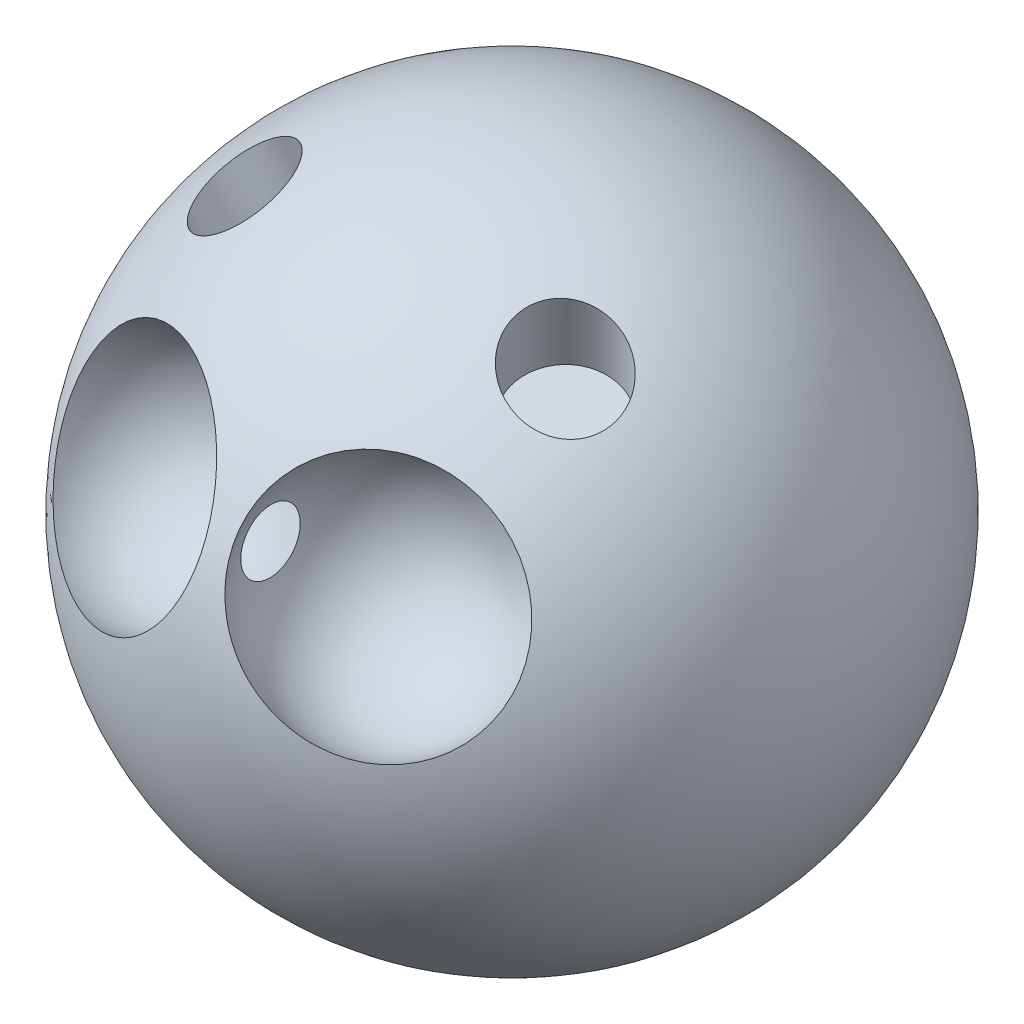
ISO-10303-21;
HEADER;
FILE_DESCRIPTION(('STEP AP214'),'2;1');
FILE_NAME('part.step','',(''),(''),'','','');
FILE_SCHEMA(('AUTOMOTIVE_DESIGN { 1 0 10303 214 1 1 1 1 }'));
ENDSEC;
DATA;
#1=APPLICATION_CONTEXT('core data for automotive mechanical design processes');
#2=APPLICATION_PROTOCOL_DEFINITION('international standard','automotive_design',2000,#1);
#3=PRODUCT_CONTEXT('',#1,'mechanical');
#4=PRODUCT('Part','Part','',(#3));
#5=PRODUCT_RELATED_PRODUCT_CATEGORY('part','',(#4));
#6=PRODUCT_DEFINITION_FORMATION('','',#4);
#7=PRODUCT_DEFINITION_CONTEXT('part definition',#1,'design');
#8=PRODUCT_DEFINITION('design','',#6,#7);
#9=PRODUCT_DEFINITION_SHAPE('','',#8);
#10=(LENGTH_UNIT() NAMED_UNIT(*) SI_UNIT(.MILLI.,.METRE.));
#11=(NAMED_UNIT(*) PLANE_ANGLE_UNIT() SI_UNIT($,.RADIAN.));
#12=(NAMED_UNIT(*) SI_UNIT($,.STERADIAN.) SOLID_ANGLE_UNIT());
#13=UNCERTAINTY_MEASURE_WITH_UNIT(LENGTH_MEASURE(1.E-05),#10,'distance_accuracy_value','');
#14=(GEOMETRIC_REPRESENTATION_CONTEXT(3) GLOBAL_UNCERTAINTY_ASSIGNED_CONTEXT((#13)) GLOBAL_UNIT_ASSIGNED_CONTEXT((#10,
#11,#12)) REPRESENTATION_CONTEXT('',''));
#15=CARTESIAN_POINT('',(0.,0.,0.));
#16=DIRECTION('',(0.,0.,1.));
#17=DIRECTION('',(1.,0.,0.));
#18=AXIS2_PLACEMENT_3D('',#15,#16,#17);
#19=CARTESIAN_POINT('',(2.3203755460968,10.677854660032,2.37286682040429));
#20=DIRECTION('',(0.207514785544147,0.9549371107515,0.212209161654592));
#21=DIRECTION('',(0.,-0.216931348988181,0.976186862145854));
#22=AXIS2_PLACEMENT_3D('',#19,#20,#21);
#23=PLANE('',#22);
#24=CARTESIAN_POINT('',(6.83732854207996,9.24554378475854,4.40120656455625));
#25=DIRECTION('',(0.207514785544146,0.9549371107515,0.212209161654592));
#26=DIRECTION('',(0.,-0.216931348988181,0.976186862145854));
#27=AXIS2_PLACEMENT_3D('',#24,#25,#26);
#28=CIRCLE('',#27,2.25);
#29=CARTESIAN_POINT('',(6.83732854207996,8.75744824953514,6.59762700438442));
#30=VERTEX_POINT('',#29);
#31=EDGE_CURVE('E22',#30,#30,#28,.T.);
#32=ORIENTED_EDGE('',*,*,#31,.T.);
#33=EDGE_LOOP('',(#32));
#34=FACE_BOUND('',#33,.T.);
#35=ADVANCED_FACE('F17',(#34),#23,.T.);
#36=CARTESIAN_POINT('',(6.83732854207996,9.24554378475854,4.40120656455625));
#37=DIRECTION('',(0.207514785544146,0.9549371107515,0.212209161654592));
#38=DIRECTION('',(0.,-0.216931348988181,0.976186862145854));
#39=AXIS2_PLACEMENT_3D('',#36,#37,#38);
#40=CYLINDRICAL_SURFACE('',#39,2.25);
#41=ORIENTED_EDGE('',*,*,#31,.F.);
#42=EDGE_LOOP('',(#41));
#43=FACE_BOUND('',#42,.T.);
#44=CARTESIAN_POINT('',(7.4785121058429,12.6842241577591,2.86047447086711));
#45=CARTESIAN_POINT('',(7.60103985984923,12.6154258421237,2.84519672109731));
#46=CARTESIAN_POINT('',(7.72271245972928,12.5421947693737,2.84130911592228));
#47=CARTESIAN_POINT('',(7.96072406003778,12.3891273387208,2.85597069634072));
#48=CARTESIAN_POINT('',(8.07704779526739,12.309273703742,2.87458040520665));
#49=CARTESIAN_POINT('',(8.30071690439664,12.145512988355,2.9333651382507));
#50=CARTESIAN_POINT('',(8.40807975295584,12.0616143256395,2.97349699998186));
#51=CARTESIAN_POINT('',(8.61109351229488,11.8919805990403,3.07406710184202));
#52=CARTESIAN_POINT('',(8.7067507495368,11.8062465568165,3.13449430634459));
#53=CARTESIAN_POINT('',(8.88517495349177,11.6338675983562,3.27527975958107));
#54=CARTESIAN_POINT('',(8.96770728920141,11.547230508384,3.35594582410442));
#55=CARTESIAN_POINT('',(9.11531227635691,11.3770586819066,3.53472675100574));
#56=CARTESIAN_POINT('',(9.18038329151202,11.29352423678,3.63284324722251));
#57=CARTESIAN_POINT('',(9.28932687738384,11.134186692806,3.84161990098054));
#58=CARTESIAN_POINT('',(9.33364869050764,11.0582507988136,3.95194329672969));
#59=CARTESIAN_POINT('',(9.40120780498793,10.9147483884994,4.18393150816854));
#60=CARTESIAN_POINT('',(9.42445323376333,10.8471786547275,4.30559193212877));
#61=CARTESIAN_POINT('',(9.44761580119429,10.7268971305227,4.54903027891771));
#62=CARTESIAN_POINT('',(9.44885185335802,10.6735361628303,4.67036109384015));
#63=CARTESIAN_POINT('',(9.4306826112496,10.5788163455998,4.91612373439234));
#64=CARTESIAN_POINT('',(9.41128754978553,10.537451559031,5.04055399285114));
#65=CARTESIAN_POINT('',(9.35407697091048,10.4708768564171,5.27987774770868));
#66=CARTESIAN_POINT('',(9.31761108902991,10.4447560052466,5.39484178204949));
#67=CARTESIAN_POINT('',(9.22784676195085,10.4054779075706,5.62031772445839));
#68=CARTESIAN_POINT('',(9.17455275990638,10.3923172429409,5.7308307990455));
#69=CARTESIAN_POINT('',(9.05516794182463,10.3796161069456,5.9398200127197));
#70=CARTESIAN_POINT('',(8.98965613863802,10.379565299891,6.03859727502475));
#71=CARTESIAN_POINT('',(8.84662095554112,10.3916288934296,6.22617794757083));
#72=CARTESIAN_POINT('',(8.76909865815432,10.4037421981924,6.3149822554459));
#73=CARTESIAN_POINT('',(8.60359791809942,10.4396557080024,6.48119602771535));
#74=CARTESIAN_POINT('',(8.51552841679281,10.4635642167804,6.55849108408079));
#75=CARTESIAN_POINT('',(8.33200574154263,10.5221030559701,6.69904872952074));
#76=CARTESIAN_POINT('',(8.23654782957956,10.5567403099361,6.76230221180096));
#77=CARTESIAN_POINT('',(8.03582768281209,10.6374708464962,6.87643842939391));
#78=CARTESIAN_POINT('',(7.9303137124515,10.6840584295398,6.92652541476343));
#79=CARTESIAN_POINT('',(7.71687488225179,10.7860161440531,7.0090903615867));
#80=CARTESIAN_POINT('',(7.6089543933069,10.8413713156814,7.04159790856278));
#81=CARTESIAN_POINT('',(7.47171462931442,10.9163378355368,7.07164921182621));
#82=CARTESIAN_POINT('',(7.44225566129432,10.9326985377208,7.07743607028014));
#83=CARTESIAN_POINT('',(7.3833928465352,10.9659195738631,7.08768557153004));
#84=CARTESIAN_POINT('',(7.35398899545271,10.9827798665257,7.09214832344126));
#85=CARTESIAN_POINT('',(7.20225942373118,11.0711479034898,7.11178032346351));
#86=CARTESIAN_POINT('',(7.0805951855199,11.1466017959765,7.11609093009157));
#87=CARTESIAN_POINT('',(6.84224550659412,11.3034273129031,7.10188010699347));
#88=CARTESIAN_POINT('',(6.72557378789431,11.384813768751,7.08329946940093));
#89=CARTESIAN_POINT('',(6.50077705093237,11.5509293147375,7.02397995612368));
#90=CARTESIAN_POINT('',(6.39263989310173,11.6356533903615,6.98327322772186));
#91=CARTESIAN_POINT('',(6.18786907318596,11.8061422803649,6.88081743460818));
#92=CARTESIAN_POINT('',(6.091228884652,11.8919064735376,6.81908038575946));
#93=CARTESIAN_POINT('',(5.91187710440432,12.0625629373178,6.67569053918166));
#94=CARTESIAN_POINT('',(5.82923622412704,12.1474488600708,6.59394145359302));
#95=CARTESIAN_POINT('',(5.68134316332917,12.3134144698102,6.41270020997014));
#96=CARTESIAN_POINT('',(5.61609070664043,12.3944942172306,6.3132083337741));
#97=CARTESIAN_POINT('',(5.50753328140063,12.5475798116244,6.10282791568016));
#98=CARTESIAN_POINT('',(5.46355503328422,12.6198009493357,5.9924444661757));
#99=CARTESIAN_POINT('',(5.39638274946188,12.7558729383684,5.76072217716508));
#100=CARTESIAN_POINT('',(5.37318090772412,12.8197269256594,5.63938747110033));
#101=CARTESIAN_POINT('',(5.34974247248207,12.9333696536509,5.39678005356226));
#102=CARTESIAN_POINT('',(5.34825604464876,12.9837580253554,5.27590908877723));
#103=CARTESIAN_POINT('',(5.36565427214117,13.0732859308473,5.03149534051164));
#104=CARTESIAN_POINT('',(5.38453136421555,13.1124296342018,4.90795356569675));
#105=CARTESIAN_POINT('',(5.44085089555553,13.1762327826826,4.66896540957149));
#106=CARTESIAN_POINT('',(5.47722175730061,13.2015671831209,4.55344574570772));
#107=CARTESIAN_POINT('',(5.56705413971028,13.2400558720007,4.32712519164566));
#108=CARTESIAN_POINT('',(5.62051235917482,13.2532125112192,4.21632339465863));
#109=CARTESIAN_POINT('',(5.74114790833286,13.2667548012328,4.00584309256731));
#110=CARTESIAN_POINT('',(5.80789069940385,13.2674938265754,3.90593753727263));
#111=CARTESIAN_POINT('',(5.95394296836148,13.2571722194252,3.71648727213736));
#112=CARTESIAN_POINT('',(6.03325114291118,13.2461128100368,3.62694148940039));
#113=CARTESIAN_POINT('',(6.20261271431301,13.2125408579979,3.45989718792941));
#114=CARTESIAN_POINT('',(6.29273588289742,13.1899505110118,3.38248524117835));
#115=CARTESIAN_POINT('',(6.48068259915085,13.1340673960499,3.24215524100024));
#116=CARTESIAN_POINT('',(6.57851087854388,13.1007680123236,3.17924618841809));
#117=CARTESIAN_POINT('',(6.78302100440717,13.0230490609199,3.06700629306905));
#118=CARTESIAN_POINT('',(6.88989940171491,12.9782460450068,3.01830157346337));
#119=CARTESIAN_POINT('',(7.10589471378514,12.8796745863431,2.93868490762089));
#120=CARTESIAN_POINT('',(7.21500717820352,12.8259226862412,2.907740590966));
#121=CARTESIAN_POINT('',(7.37547806704141,12.7412109489824,2.87531045217282));
#122=CARTESIAN_POINT('',(7.4270704524121,12.7131082186662,2.86688863160346));
#123=CARTESIAN_POINT('',(7.4785121058429,12.6842241577591,2.86047447086711));
#124=B_SPLINE_CURVE_WITH_KNOTS('',3,(#44,#45,#46,#47,#48,#49,#50,#51,#52,#53,#54,#55,#56,#57,
#58,#59,#60,#61,#62,#63,#64,#65,#66,#67,#68,#69,#70,#71,#72,#73,#74,#75,#76,#77,#78,#79,#80,#81,
#82,#83,#84,#85,#86,#87,#88,#89,#90,#91,#92,#93,#94,#95,#96,#97,#98,#99,#100,#101,#102,#103,
#104,#105,#106,#107,#108,#109,#110,#111,#112,#113,#114,#115,#116,#117,#118,#119,#120,#121,#122,
#123),.UNSPECIFIED.,.T.,.F.,(4,2,2,2,2,2,2,2,2,2,2,2,2,2,2,2,2,2,2,2,2,2,2,2,2,2,2,2,2,2,2,2,2,
2,2,2,2,2,2,4),(0.,0.423871964808461,0.848886790879534,1.27305242442544,1.69698778959754,
2.12780957699162,2.55867172237075,2.9797162514107,3.40059834924786,3.79616809217035,
4.19154172824241,4.55989178228237,4.92814466150931,5.28206007781559,5.63594361374258,
5.99313874567525,6.35056486739134,6.72622578878604,7.10125250396811,7.20380594983477,
7.30635094226107,7.7336863392884,8.16212935726978,8.58995154233865,9.01752969620657,
9.44720703506227,9.87687754924725,10.291877966349,10.7067223955823,11.0975897039997,
11.4883118896585,11.8576696954312,12.2269561860364,12.5857153126544,12.944437251527,
13.3056122874628,13.6670108774691,14.042521376796,14.4173452728275,14.5953022988869),.UNSPECIFIED.);
#125=CARTESIAN_POINT('',(7.4785121058429,12.6842241577591,2.86047447086711));
#126=VERTEX_POINT('',#125);
#127=EDGE_CURVE('E49',#126,#126,#124,.T.);
#128=ORIENTED_EDGE('',*,*,#127,.F.);
#129=EDGE_LOOP('',(#128));
#130=FACE_BOUND('',#129,.T.);
#131=ADVANCED_FACE('F83',(#43,#130),#40,.F.);
#132=CARTESIAN_POINT('',(-4.2557417320725,8.92650718043939,2.49077389771273));
#133=DIRECTION('',(0.417314178615178,-0.875325206845538,-0.24424303180962));
#134=DIRECTION('',(0.902663218723563,0.430347665920957,0.));
#135=AXIS2_PLACEMENT_3D('',#132,#133,#134);
#136=PLANE('',#135);
#137=CARTESIAN_POINT('',(-5.02179504310474,8.09303607790022,4.16891125919332));
#138=DIRECTION('',(-0.417314178615178,0.875325206845538,0.24424303180962));
#139=DIRECTION('',(-0.902663218723563,-0.430347665920958,0.));
#140=AXIS2_PLACEMENT_3D('',#137,#138,#139);
#141=CIRCLE('',#140,2.25);
#142=CARTESIAN_POINT('',(-7.05278728523276,7.12475382957807,4.16891125919332));
#143=VERTEX_POINT('',#142);
#144=EDGE_CURVE('E48',#143,#143,#141,.T.);
#145=ORIENTED_EDGE('',*,*,#144,.T.);
#146=EDGE_LOOP('',(#145));
#147=FACE_BOUND('',#146,.T.);
#148=ADVANCED_FACE('F38',(#147),#136,.F.);
#149=CARTESIAN_POINT('',(5.44495098577105,4.93559259326842,11.2490065171851));
#150=DIRECTION('',(-0.997531014771984,0.00821354652691298,-0.0697453383490687));
#151=DIRECTION('',(0.,0.993137027427932,0.116956593450783));
#152=AXIS2_PLACEMENT_3D('',#149,#150,#151);
#153=CIRCLE('',#152,5.1);
#154=TRIMMED_CURVE('',#153,(PARAMETER_VALUE(-1.60235416746791)),
(PARAMETER_VALUE(1.60235416746791)),.T.,.PARAMETER.);
#155=CARTESIAN_POINT('',(5.44495098577105,4.7757786963244,11.2301860639582));
#156=DIRECTION('',(0.0702273064268867,0.116667829349234,-0.990684986777816));
#157=AXIS1_PLACEMENT('',#155,#156);
#158=SURFACE_OF_REVOLUTION('',#154,#157);
#159=CARTESIAN_POINT('',(5.80293191530973,5.37048836821735,6.1802083046876));
#160=VERTEX_POINT('',#159);
#161=VERTEX_LOOP('',#160);
#162=FACE_BOUND('',#161,.T.);
#163=CARTESIAN_POINT('',(0.386069457796595,6.02429740025218,11.9371788407207));
#164=CARTESIAN_POINT('',(0.383571294539956,6.05592016865654,11.8664813614156));
#165=CARTESIAN_POINT('',(0.381051556847846,6.08160635049293,11.7930530194618));
#166=CARTESIAN_POINT('',(0.376039469427233,6.12028130063957,11.6427944021987));
#167=CARTESIAN_POINT('',(0.373547187724449,6.13324349400914,11.5659573556862));
#168=CARTESIAN_POINT('',(0.36866582637556,6.14601637372121,11.4112483808981));
#169=CARTESIAN_POINT('',(0.366276665895042,6.14583755548152,11.3333773281613));
#170=CARTESIAN_POINT('',(0.361667461577325,6.13237868015937,11.1788110713337));
#171=CARTESIAN_POINT('',(0.359447340550708,6.11910464193842,11.1021153434828));
#172=CARTESIAN_POINT('',(0.355239096472867,6.07992316029254,10.9521369963029));
#173=CARTESIAN_POINT('',(0.353250643782945,6.05403394577828,10.8788496187954));
#174=CARTESIAN_POINT('',(0.349555630819854,5.99042551881705,10.7375913034767));
#175=CARTESIAN_POINT('',(0.347849101736138,5.95270499879879,10.6696209543301));
#176=CARTESIAN_POINT('',(0.344748922357896,5.86615320060616,10.5402316053568));
#177=CARTESIAN_POINT('',(0.343358363300307,5.81722083276199,10.4788801801706));
#178=CARTESIAN_POINT('',(0.34094762904314,5.70988713194088,10.3651061612302));
#179=CARTESIAN_POINT('',(0.339927477977902,5.65148518232143,10.3126841494));
#180=CARTESIAN_POINT('',(0.338271833790109,5.52594464260176,10.2174233109198));
#181=CARTESIAN_POINT('',(0.337642286082526,5.45868905267452,10.1747385770551));
#182=CARTESIAN_POINT('',(0.336808393884095,5.31804554913335,10.1010724737334));
#183=CARTESIAN_POINT('',(0.336604084750955,5.24465712611469,10.0700920776434));
#184=CARTESIAN_POINT('',(0.336625919871889,5.0927014657518,10.0202749058728));
#185=CARTESIAN_POINT('',(0.336858263878413,5.01407516098749,10.0016181935033));
#186=CARTESIAN_POINT('',(0.337758973323696,4.85481313509537,9.97765919588256));
#187=CARTESIAN_POINT('',(0.338427366522752,4.77417728634789,9.97235776097585));
#188=CARTESIAN_POINT('',(0.340187775180031,4.61258666423818,9.97528235372078));
#189=CARTESIAN_POINT('',(0.341282724191338,4.53163361141526,9.98360336452438));
#190=CARTESIAN_POINT('',(0.343865004086568,4.3722977118484,10.0137683168125));
#191=CARTESIAN_POINT('',(0.345352298321592,4.29391462581277,10.0356109954969));
#192=CARTESIAN_POINT('',(0.348669649954927,4.14232473057152,10.0921459653206));
#193=CARTESIAN_POINT('',(0.350498173135223,4.06909669771887,10.12678139549));
#194=CARTESIAN_POINT('',(0.35445101159019,3.92957250004664,10.2080293514495));
#195=CARTESIAN_POINT('',(0.356575449719809,3.86327923445281,10.254646858666));
#196=CARTESIAN_POINT('',(0.361029539855441,3.74044967820475,10.3579155513946));
#197=CARTESIAN_POINT('',(0.363356333516027,3.68380300234796,10.4144357138238));
#198=CARTESIAN_POINT('',(0.368166398865619,3.58110585292716,10.5362262200856));
#199=CARTESIAN_POINT('',(0.370649301500993,3.53503150285494,10.6014763095484));
#200=CARTESIAN_POINT('',(0.374752973673983,3.46983007112263,10.7130738268592));
#201=CARTESIAN_POINT('',(0.376348514986667,3.44707218661595,10.7573528852501));
#202=CARTESIAN_POINT('',(0.380451120838788,3.39514102350218,10.8734561841267));
#203=CARTESIAN_POINT('',(0.382970859054585,3.36945563001468,10.9468848112531));
#204=CARTESIAN_POINT('',(0.387982942946644,3.33078229841938,11.0971438608496));
#205=CARTESIAN_POINT('',(0.390475220594483,3.31782093302581,11.1739810536753));
#206=CARTESIAN_POINT('',(0.39535656948105,3.30504972252814,11.3286901805591));
#207=CARTESIAN_POINT('',(0.397745721552199,3.30522938271892,11.4065612392542));
#208=CARTESIAN_POINT('',(0.402354905051295,3.31868992943162,11.5611273708476));
#209=CARTESIAN_POINT('',(0.404575013662679,3.33196479771128,11.6378229675172));
#210=CARTESIAN_POINT('',(0.408783229196951,3.37114790294189,11.7878009177236));
#211=CARTESIAN_POINT('',(0.410771665758613,3.39703791133076,11.861088029558));
#212=CARTESIAN_POINT('',(0.414466643149414,3.46064786751288,12.0023456861662));
#213=CARTESIAN_POINT('',(0.416173152791479,3.49836912275608,12.070315642313));
#214=CARTESIAN_POINT('',(0.419273290744273,3.58492233036128,12.1997041039204));
#215=CARTESIAN_POINT('',(0.420663827709497,3.6338553743596,12.2610550318617));
#216=CARTESIAN_POINT('',(0.423074515438938,3.74119033515853,12.3748279525569));
#217=CARTESIAN_POINT('',(0.424094642067563,3.79959286862372,12.4272493633537));
#218=CARTESIAN_POINT('',(0.425750235379024,3.92513448253755,12.5225089074342));
#219=CARTESIAN_POINT('',(0.426379756585527,3.99239056191752,12.5651929456999));
#220=CARTESIAN_POINT('',(0.427213594661846,4.13303492321306,12.6388575848756));
#221=CARTESIAN_POINT('',(0.427417876174212,4.20642371451822,12.6698372124225));
#222=CARTESIAN_POINT('',(0.427395985024249,4.35837997514417,12.7196527787232));
#223=CARTESIAN_POINT('',(0.427163612661441,4.43700650945328,12.7383086550648));
#224=CARTESIAN_POINT('',(0.426262846989663,4.59626885237935,12.7622659494735));
#225=CARTESIAN_POINT('',(0.425594425920249,4.67690478860775,12.7675665171887));
#226=CARTESIAN_POINT('',(0.423833962879541,4.83849541334448,12.7646401747559));
#227=CARTESIAN_POINT('',(0.422738987498775,4.91944838036219,12.7563182857497));
#228=CARTESIAN_POINT('',(0.420156657190732,5.07878395918748,12.7261515990095));
#229=CARTESIAN_POINT('',(0.418669338917146,5.15716681033329,12.7043080642462));
#230=CARTESIAN_POINT('',(0.41535194298043,5.30875606363077,12.6477714426618));
#231=CARTESIAN_POINT('',(0.41352339965283,5.38198369187559,12.6131352214594));
#232=CARTESIAN_POINT('',(0.409570524640883,5.52150695341335,12.531885758446));
#233=CARTESIAN_POINT('',(0.407446070089759,5.58779968710957,12.4852675346964));
#234=CARTESIAN_POINT('',(0.40299195203716,5.71062806009242,12.3819975265725));
#235=CARTESIAN_POINT('',(0.400665146855984,5.7672740871844,12.3254767653785));
#236=CARTESIAN_POINT('',(0.395855063153968,5.86996984269078,12.2036851812411));
#237=CARTESIAN_POINT('',(0.393372153706285,5.91604344970266,12.1384346140237));
#238=CARTESIAN_POINT('',(0.389268792067984,5.98123857640191,12.0268450716674));
#239=CARTESIAN_POINT('',(0.387673572665623,6.00399186062724,11.9825749442198));
#240=CARTESIAN_POINT('',(0.386069457796595,6.02429740025218,11.9371788407207));
#241=B_SPLINE_CURVE_WITH_KNOTS('',3,(#163,#164,#165,#166,#167,#168,#169,#170,#171,#172,#173,
#174,#175,#176,#177,#178,#179,#180,#181,#182,#183,#184,#185,#186,#187,#188,#189,#190,#191,#192,
#193,#194,#195,#196,#197,#198,#199,#200,#201,#202,#203,#204,#205,#206,#207,#208,#209,#210,#211,
#212,#213,#214,#215,#216,#217,#218,#219,#220,#221,#222,#223,#224,#225,#226,#227,#228,#229,#230,
#231,#232,#233,#234,#235,#236,#237,#238,#239,#240),.UNSPECIFIED.,.T.,.F.,(4,2,2,2,2,2,2,2,2,2,2,
2,2,2,2,2,2,2,2,2,2,2,2,2,2,2,2,2,2,2,2,2,2,2,2,2,2,2,4),(0.,0.232307301303967,
0.465098766844112,0.69770430932206,0.93020299077844,1.16236670382554,1.39455608416995,
1.62892763235843,1.86331444854359,2.10118658466828,2.33907849857913,2.58037362444649,
2.82168411343822,3.0646843283803,3.30766185274669,3.54957214280347,3.79158316772873,
4.03060542276481,4.26908243795093,4.41828105321273,4.65058840807891,4.88337988537882,
5.1159854524394,5.34848416936225,5.58064792328658,5.81283734225715,6.0472089875865,
6.28159590161467,6.51946815792264,6.75736019182986,6.99865540801164,7.2399659874228,
7.48296621609404,7.72594375108848,7.96785396047772,8.20986491570918,8.44888707072875,
8.68736394298202,8.83653257526217),.UNSPECIFIED.);
#242=CARTESIAN_POINT('',(0.386069457796595,6.02429740025218,11.9371788407207));
#243=VERTEX_POINT('',#242);
#244=EDGE_CURVE('E43',#243,#243,#241,.T.);
#245=ORIENTED_EDGE('',*,*,#244,.T.);
#246=EDGE_LOOP('',(#245));
#247=FACE_BOUND('',#246,.T.);
#248=CARTESIAN_POINT('',(5.21098340292107,0.392352856546612,14.0602884469146));
#249=CARTESIAN_POINT('',(5.0781548079711,0.432165299617541,14.1084067955505));
#250=CARTESIAN_POINT('',(4.94603750323926,0.477524635722353,14.1538062134318));
#251=CARTESIAN_POINT('',(4.6840616684455,0.578999567732083,14.2388855671925));
#252=CARTESIAN_POINT('',(4.55420360412597,0.635117353491995,14.2785643357624));
#253=CARTESIAN_POINT('',(4.29761362184178,0.757705570721298,14.3519329724356));
#254=CARTESIAN_POINT('',(4.17088387285645,0.824182963611834,14.3856187805674));
#255=CARTESIAN_POINT('',(3.92146925445466,0.966984100841497,14.446750900302));
#256=CARTESIAN_POINT('',(3.79878587957133,1.04331143324641,14.4741949280803));
#257=CARTESIAN_POINT('',(3.55827567833827,1.20528043087532,14.5226580024095));
#258=CARTESIAN_POINT('',(3.44045222961576,1.29092842836798,14.5436726435558));
#259=CARTESIAN_POINT('',(3.21051650560498,1.47090499941623,14.5791172469263));
#260=CARTESIAN_POINT('',(3.09840634194798,1.5652367468523,14.5935447900149));
#261=CARTESIAN_POINT('',(2.88076985343474,1.76183081207627,14.6157015797413));
#262=CARTESIAN_POINT('',(2.77524019648617,1.86408905640198,14.6234342423676));
#263=CARTESIAN_POINT('',(2.57139534679195,2.07590155404325,14.6321628693261));
#264=CARTESIAN_POINT('',(2.47308284161125,2.18545849661181,14.6331563365393));
#265=CARTESIAN_POINT('',(2.28354385239424,2.41210910754261,14.6283691947277));
#266=CARTESIAN_POINT('',(2.19239030925066,2.52926248535483,14.6225266169598));
#267=CARTESIAN_POINT('',(2.01881154675672,2.76941879150406,14.6039982476108));
#268=CARTESIAN_POINT('',(1.93638959019272,2.89242388178143,14.5913099086469));
#269=CARTESIAN_POINT('',(1.78095686216893,3.14333696051694,14.5591776757946));
#270=CARTESIAN_POINT('',(1.70794272211346,3.27124317265985,14.5397362092217));
#271=CARTESIAN_POINT('',(1.57182449399206,3.53114742760259,14.4942199307035));
#272=CARTESIAN_POINT('',(1.50872404344818,3.6631469511444,14.468142693118));
#273=CARTESIAN_POINT('',(1.39319070283345,3.92972297349811,14.4096553093652));
#274=CARTESIAN_POINT('',(1.34071628194795,4.06428709879926,14.3772708285168));
#275=CARTESIAN_POINT('',(1.24651978776302,4.33558963296745,14.3063182150291));
#276=CARTESIAN_POINT('',(1.20480171027784,4.4723288298704,14.2677477930145));
#277=CARTESIAN_POINT('',(1.13249920709767,4.74690471872074,14.1847170775679));
#278=CARTESIAN_POINT('',(1.10191021150345,4.88474093638887,14.14025921193));
#279=CARTESIAN_POINT('',(1.05208430347053,5.16056899964855,14.0457666865439));
#280=CARTESIAN_POINT('',(1.0328515525901,5.29856088374842,13.9957299903781));
#281=CARTESIAN_POINT('',(0.992824405032603,5.70802411173487,13.8390031721485));
#282=CARTESIAN_POINT('',(0.98879498820746,5.97844260125772,13.7246471614201));
#283=CARTESIAN_POINT('',(1.02625233537061,6.50794698412557,13.4788390011012));
#284=CARTESIAN_POINT('',(1.06773697220849,6.767033406499,13.3473876507336));
#285=CARTESIAN_POINT('',(1.19457120712353,7.26453083342427,13.0722484754245));
#286=CARTESIAN_POINT('',(1.27956389855835,7.50309189513854,12.9286680288189));
#287=CARTESIAN_POINT('',(1.49084868322885,7.95497724482879,12.632492206776));
#288=CARTESIAN_POINT('',(1.61713934856766,8.16830240500072,12.4798971431727));
#289=CARTESIAN_POINT('',(1.90692124284068,8.56295141646339,12.1705824361906));
#290=CARTESIAN_POINT('',(2.0702844254986,8.74438168999835,12.0138785945488));
#291=CARTESIAN_POINT('',(2.4298109370429,9.07099715095126,11.700282123152));
#292=CARTESIAN_POINT('',(2.62597680517923,9.21617953025552,11.5433894797161));
#293=CARTESIAN_POINT('',(3.04551198511775,9.4662118827493,11.233846217319));
#294=CARTESIAN_POINT('',(3.26888500608085,9.57105634853563,11.0811961802458));
#295=CARTESIAN_POINT('',(3.73638199287209,9.73744174874603,10.7844877913225));
#296=CARTESIAN_POINT('',(3.98049707178739,9.79900112480633,10.6404258045013));
#297=CARTESIAN_POINT('',(4.44949479205808,9.87210363769674,10.3829968375289));
#298=CARTESIAN_POINT('',(4.67269132032635,9.88915480161634,10.2680836428401));
#299=CARTESIAN_POINT('',(5.1247879446768,9.88917108147528,10.0500665024856));
#300=CARTESIAN_POINT('',(5.35368844600582,9.87213376869286,9.94696339881371));
#301=CARTESIAN_POINT('',(5.85573861829291,9.7979508714453,9.7364999871947));
#302=CARTESIAN_POINT('',(6.12909037051168,9.73384581905428,9.6320052384051));
#303=CARTESIAN_POINT('',(6.66900480500727,9.56000295849788,9.44562981659139));
#304=CARTESIAN_POINT('',(6.93556414197958,9.4502431090711,9.36376009831696));
#305=CARTESIAN_POINT('',(7.44930818133133,9.19083240943685,9.22617753097125));
#306=CARTESIAN_POINT('',(7.6967559352418,9.04193818456752,9.17001878324416));
#307=CARTESIAN_POINT('',(8.17055368075535,8.70769835895288,9.08316965464546));
#308=CARTESIAN_POINT('',(8.39690624006195,8.52235720308533,9.05247617054287));
#309=CARTESIAN_POINT('',(8.82368924715226,8.11906933543978,9.01722271096378));
#310=CARTESIAN_POINT('',(9.0239348000078,7.90091138860234,9.0128401755119));
#311=CARTESIAN_POINT('',(9.39102982852968,7.43907479145729,9.0308263511565));
#312=CARTESIAN_POINT('',(9.55787796893764,7.19539512136147,9.05319613158518));
#313=CARTESIAN_POINT('',(9.85355726351195,6.68907889472507,9.12419542043592));
#314=CARTESIAN_POINT('',(9.98234115624947,6.42641927136371,9.17285736366819));
#315=CARTESIAN_POINT('',(10.1978137217001,5.8899009751395,9.29521250835752));
#316=CARTESIAN_POINT('',(10.2845035908285,5.61604262081192,9.36890499828396));
#317=CARTESIAN_POINT('',(10.4128114402252,5.0664526456406,9.53890947057985));
#318=CARTESIAN_POINT('',(10.4546642030407,4.79073846626323,9.63510038100388));
#319=CARTESIAN_POINT('',(10.4927833128847,4.24401411584283,9.84765323197816));
#320=CARTESIAN_POINT('',(10.4890513140723,3.97300377446647,9.96401444044679));
#321=CARTESIAN_POINT('',(10.4361193325401,3.44535314206994,10.2128341876199));
#322=CARTESIAN_POINT('',(10.3872532071448,3.18862199370018,10.3451683336885));
#323=CARTESIAN_POINT('',(10.2813398910754,2.81859237179941,10.5532447803307));
#324=CARTESIAN_POINT('',(10.2405695557086,2.69770039686029,10.624239556663));
#325=CARTESIAN_POINT('',(10.1484362061855,2.46174039595976,10.7689512941132));
#326=CARTESIAN_POINT('',(10.0970771831178,2.3466701959478,10.8426672210054));
#327=CARTESIAN_POINT('',(9.98442463734439,2.12378372877825,10.9919000249619));
#328=CARTESIAN_POINT('',(9.92318542013604,2.01593212724459,11.067405234541));
#329=CARTESIAN_POINT('',(9.7910365384958,1.80762042262948,11.220032897116));
#330=CARTESIAN_POINT('',(9.72013052035031,1.70715755443323,11.2971547310883));
#331=CARTESIAN_POINT('',(9.56910896506475,1.51427360246319,11.4525182638967));
#332=CARTESIAN_POINT('',(9.48899040477109,1.42185517610421,11.5307603229254));
#333=CARTESIAN_POINT('',(9.32016511289455,1.24579452039847,11.6877519854619));
#334=CARTESIAN_POINT('',(9.2314615873818,1.16214903891109,11.7665013893238));
#335=CARTESIAN_POINT('',(9.0463393972858,1.0044213016214,11.9237490165623));
#336=CARTESIAN_POINT('',(8.94994340887465,0.930312505926933,12.002247316941));
#337=CARTESIAN_POINT('',(8.74994109212718,0.791933774737614,12.1586292483915));
#338=CARTESIAN_POINT('',(8.64633745561436,0.727660194497526,12.2365130969701));
#339=CARTESIAN_POINT('',(8.43256896471257,0.609343058538406,12.3911822443513));
#340=CARTESIAN_POINT('',(8.32240064269679,0.555304973570658,12.4679669355137));
#341=CARTESIAN_POINT('',(8.09638032446443,0.457899907438045,12.61981988251));
#342=CARTESIAN_POINT('',(7.9805304293435,0.414529016613206,12.6948887580341));
#343=CARTESIAN_POINT('',(7.74391426423898,0.338727740176499,12.8428175472959));
#344=CARTESIAN_POINT('',(7.62314715242737,0.306299236803254,12.915677079037));
#345=CARTESIAN_POINT('',(7.37762048708697,0.252623028382103,13.0586289969843));
#346=CARTESIAN_POINT('',(7.25286238558217,0.231371304928727,13.1287223693171));
#347=CARTESIAN_POINT('',(7.0002667726247,0.200178450106514,13.2656344900543));
#348=CARTESIAN_POINT('',(6.87243110154971,0.190230722514822,13.3324551263915));
#349=CARTESIAN_POINT('',(6.6145592931062,0.181674483545729,13.4623722962775));
#350=CARTESIAN_POINT('',(6.48452361605546,0.18306362867858,13.5254695967757));
#351=CARTESIAN_POINT('',(6.164287629093,0.200326837488039,13.6749859983678));
#352=CARTESIAN_POINT('',(5.97332637542688,0.222433367757608,13.7591339383258));
#353=CARTESIAN_POINT('',(5.59142200132255,0.290047902935044,13.9174619147409));
#354=CARTESIAN_POINT('',(5.40047888078049,0.335555764570156,13.9916420122218));
#355=CARTESIAN_POINT('',(5.21098340292107,0.392352856546612,14.0602884469146));
#356=B_SPLINE_CURVE_WITH_KNOTS('',3,(#248,#249,#250,#251,#252,#253,#254,#255,#256,#257,#258,
#259,#260,#261,#262,#263,#264,#265,#266,#267,#268,#269,#270,#271,#272,#273,#274,#275,#276,#277,
#278,#279,#280,#281,#282,#283,#284,#285,#286,#287,#288,#289,#290,#291,#292,#293,#294,#295,#296,
#297,#298,#299,#300,#301,#302,#303,#304,#305,#306,#307,#308,#309,#310,#311,#312,#313,#314,#315,
#316,#317,#318,#319,#320,#321,#322,#323,#324,#325,#326,#327,#328,#329,#330,#331,#332,#333,#334,
#335,#336,#337,#338,#339,#340,#341,#342,#343,#344,#345,#346,#347,#348,#349,#350,#351,#352,#353,
#354,#355),.UNSPECIFIED.,.T.,.F.,(4,2,2,2,2,2,2,2,2,2,2,2,2,2,2,2,2,2,2,2,2,2,2,2,2,2,2,2,2,2,2,
2,2,2,2,2,2,2,2,2,2,2,2,2,2,2,2,2,2,2,2,2,2,4),(0.,0.44015155087072,0.880392788773091,
1.32093114470072,1.76163043219519,2.20263101326542,2.64379342337756,3.08473060237123,
3.52583115583819,3.97096146507316,4.4162575265264,4.8613936979885,5.30669281887974,
5.75021643112944,6.19390456888379,6.63741031022333,7.0810784759737,7.95737803878745,
8.83363664850154,9.7028196263908,10.5719725550467,11.4381679786938,12.3044304854385,
13.1708112225252,14.0368226135976,14.7890714572054,15.5413738986378,16.435584355357,
17.3302270217456,18.2087044002433,19.0870747105857,19.9713621215011,20.8556848799586,
21.741101064982,22.6264920828359,23.5072238805693,24.3879237188039,25.2621607435796,
25.6997424082667,26.1371594402021,26.5722493978501,27.0071756926938,27.4422451208551,
27.8771526939677,28.3108224982792,28.7443312015015,29.1780709601816,29.6116515101284,
30.0453066038188,30.4788056780339,30.9120516623428,31.3452080909316,31.9731394421757,
32.6010669490068),.UNSPECIFIED.);
#357=CARTESIAN_POINT('',(5.21098340292107,0.392352856546612,14.0602884469146));
#358=VERTEX_POINT('',#357);
#359=EDGE_CURVE('E46',#358,#358,#356,.T.);
#360=ORIENTED_EDGE('',*,*,#359,.F.);
#361=EDGE_LOOP('',(#360));
#362=FACE_BOUND('',#361,.T.);
#363=ADVANCED_FACE('F34',(#162,#247,#362),#158,.F.);
#364=CARTESIAN_POINT('',(-5.02179504310474,8.09303607790022,4.16891125919332));
#365=DIRECTION('',(-0.417314178615178,0.875325206845538,0.24424303180962));
#366=DIRECTION('',(-0.902663218723563,-0.430347665920958,0.));
#367=AXIS2_PLACEMENT_3D('',#364,#365,#366);
#368=CYLINDRICAL_SURFACE('',#367,2.25);
#369=ORIENTED_EDGE('',*,*,#144,.F.);
#370=EDGE_LOOP('',(#369));
#371=FACE_BOUND('',#370,.T.);
#372=CARTESIAN_POINT('',(-8.86052257251569,10.9165163561086,5.22693125923355));
#373=CARTESIAN_POINT('',(-8.88024859005726,10.9579040123064,5.10705139457309));
#374=CARTESIAN_POINT('',(-8.89050087390658,11.0046604861176,4.98727588916141));
#375=CARTESIAN_POINT('',(-8.89174416105681,11.1075120509253,4.75149135389093));
#376=CARTESIAN_POINT('',(-8.88269219235666,11.1636277195612,4.63549131185706));
#377=CARTESIAN_POINT('',(-8.8455843522607,11.2834761970619,4.41081934813921));
#378=CARTESIAN_POINT('',(-8.81754794314149,11.3472011500646,4.30214004678291));
#379=CARTESIAN_POINT('',(-8.74331162115642,11.4804621698857,4.09512133495274));
#380=CARTESIAN_POINT('',(-8.6971205364428,11.5499953993666,3.99677692829931));
#381=CARTESIAN_POINT('',(-8.58772285806723,11.6931359977075,3.81289859578954));
#382=CARTESIAN_POINT('',(-8.52447139415984,11.7667536976119,3.72739939063119));
#383=CARTESIAN_POINT('',(-8.38276918227749,11.9158168909493,3.57198869677644));
#384=CARTESIAN_POINT('',(-8.30431712202172,11.9912625416985,3.50207855501914));
#385=CARTESIAN_POINT('',(-8.13464110370511,12.1416318450983,3.38007670916707));
#386=CARTESIAN_POINT('',(-8.04345083714706,12.2165563444801,3.32793921034175));
#387=CARTESIAN_POINT('',(-7.85072056955867,12.3639339704819,3.2428150226292));
#388=CARTESIAN_POINT('',(-7.74918105455801,12.436387212946,3.20982743489526));
#389=CARTESIAN_POINT('',(-7.53943707829078,12.5762024962548,3.1642224954965));
#390=CARTESIAN_POINT('',(-7.43128738886823,12.6435981907665,3.15145647601591));
#391=CARTESIAN_POINT('',(-7.2107508723418,12.7719301189687,3.1462920363524));
#392=CARTESIAN_POINT('',(-7.09836425952924,12.8328666787509,3.15389258744626));
#393=CARTESIAN_POINT('',(-6.87362405426538,12.9459850319648,3.18916253705061));
#394=CARTESIAN_POINT('',(-6.76127913830537,12.9982401814228,3.21665202150078));
#395=CARTESIAN_POINT('',(-6.53886145571997,13.0931332572958,3.29076622872911));
#396=CARTESIAN_POINT('',(-6.42878861793932,13.1357714853029,3.33739035130501));
#397=CARTESIAN_POINT('',(-6.21480686967459,13.2099447492167,3.44808899165048));
#398=CARTESIAN_POINT('',(-6.11086212546075,13.2415510893791,3.51204651065306));
#399=CARTESIAN_POINT('',(-5.91132652937477,13.2931467655346,3.65571393058692));
#400=CARTESIAN_POINT('',(-5.81573480619744,13.3131373144051,3.73542218572041));
#401=CARTESIAN_POINT('',(-5.6357577481635,13.3409275667886,3.90814658999071));
#402=CARTESIAN_POINT('',(-5.55135287418842,13.348748789139,4.00113893032254));
#403=CARTESIAN_POINT('',(-5.39585419956009,13.3520739698095,4.19792938747155));
#404=CARTESIAN_POINT('',(-5.32476689535806,13.3475719333433,4.30173273979892));
#405=CARTESIAN_POINT('',(-5.19758237291403,13.3263581110576,4.51765626131739));
#406=CARTESIAN_POINT('',(-5.14156033325677,13.3095865897723,4.62981470006533));
#407=CARTESIAN_POINT('',(-5.04654108619753,13.2642941540614,4.85867579372449));
#408=CARTESIAN_POINT('',(-5.00750862903072,13.2357978075875,4.97536848740278));
#409=CARTESIAN_POINT('',(-4.96835978444117,13.1916670953115,5.12803752755483));
#410=CARTESIAN_POINT('',(-4.96009532948305,13.1809361459418,5.16350823254664));
#411=CARTESIAN_POINT('',(-4.94520515714862,13.1585145832654,5.23448953424504));
#412=CARTESIAN_POINT('',(-4.93857941337153,13.1468239854233,5.27000013029968));
#413=CARTESIAN_POINT('',(-4.91319831654218,13.0935711583683,5.42543160385259));
#414=CARTESIAN_POINT('',(-4.9030715534107,13.0470897862679,5.54525008725322));
#415=CARTESIAN_POINT('',(-4.90202968477736,12.944715845318,5.78109221400736));
#416=CARTESIAN_POINT('',(-4.91115754836149,12.8888024839744,5.89710678177025));
#417=CARTESIAN_POINT('',(-4.94835165222136,12.7692695972927,6.12177067998921));
#418=CARTESIAN_POINT('',(-4.9763980462039,12.7056582048229,6.23042759760549));
#419=CARTESIAN_POINT('',(-5.05057810892915,12.5725268396438,6.43737055523872));
#420=CARTESIAN_POINT('',(-5.0967030117954,12.5030097432583,6.53566159217756));
#421=CARTESIAN_POINT('',(-5.20591461761719,12.3597729684053,6.7194546261498));
#422=CARTESIAN_POINT('',(-5.2690535852598,12.2860409014155,6.8049159310433));
#423=CARTESIAN_POINT('',(-5.41047398533127,12.1366611319178,6.96023268063542));
#424=CARTESIAN_POINT('',(-5.48875679485718,12.0610132557409,7.0300867048486));
#425=CARTESIAN_POINT('',(-5.65811396162463,11.9101198892769,7.15201638821658));
#426=CARTESIAN_POINT('',(-5.74916373911351,11.8348739076052,7.20412556500842));
#427=CARTESIAN_POINT('',(-5.94161029114213,11.6868181049467,7.2891765935558));
#428=CARTESIAN_POINT('',(-6.04300659650163,11.6140081736919,7.32211931399207));
#429=CARTESIAN_POINT('',(-6.25249910157228,11.4734736082919,7.36762967810165));
#430=CARTESIAN_POINT('',(-6.36054144642218,11.4057159569942,7.38034319014678));
#431=CARTESIAN_POINT('',(-6.58090115237877,11.2767022573066,7.38539307474386));
#432=CARTESIAN_POINT('',(-6.69321828350074,11.2154458598173,7.37773054200965));
#433=CARTESIAN_POINT('',(-6.91780654028403,11.1018008308672,7.34234095353473));
#434=CARTESIAN_POINT('',(-7.03006800099612,11.0493336118828,7.31480486691939));
#435=CARTESIAN_POINT('',(-7.25237245627753,10.9541119206212,7.24061609250679));
#436=CARTESIAN_POINT('',(-7.36241553083157,10.9113570975873,7.19396409523866));
#437=CARTESIAN_POINT('',(-7.57631408536252,10.8370888106386,7.08327159185053));
#438=CARTESIAN_POINT('',(-7.68020888150954,10.8054955378847,7.01936055102702));
#439=CARTESIAN_POINT('',(-7.8797044763232,10.7540197570808,6.87583273983981));
#440=CARTESIAN_POINT('',(-7.97530615243061,10.7341360088308,6.7962176339457));
#441=CARTESIAN_POINT('',(-8.1553406181271,10.7066418237027,6.6237406652731));
#442=CARTESIAN_POINT('',(-8.23979505846935,10.6990072640222,6.53090523154261));
#443=CARTESIAN_POINT('',(-8.3954482697728,10.6961049520325,6.33446894385004));
#444=CARTESIAN_POINT('',(-8.46664055927685,10.7008432296581,6.23086286441101));
#445=CARTESIAN_POINT('',(-8.5941154874821,10.7225533402069,6.01530727575243));
#446=CARTESIAN_POINT('',(-8.65031571318461,10.739590960112,5.90331581385848));
#447=CARTESIAN_POINT('',(-8.74571441640817,10.7854093141643,5.67478848226908));
#448=CARTESIAN_POINT('',(-8.78494790309765,10.8141656273535,5.55826251620385));
#449=CARTESIAN_POINT('',(-8.82443402036466,10.8586886687025,5.40552630652732));
#450=CARTESIAN_POINT('',(-8.8328182199367,10.8695768980412,5.36983075554113));
#451=CARTESIAN_POINT('',(-8.84792295472536,10.8923232519526,5.29839746574161));
#452=CARTESIAN_POINT('',(-8.85464351687832,10.9041813608175,5.26265972762076));
#453=CARTESIAN_POINT('',(-8.86052257251569,10.9165163561086,5.22693125923355));
#454=B_SPLINE_CURVE_WITH_KNOTS('',3,(#372,#373,#374,#375,#376,#377,#378,#379,#380,#381,#382,
#383,#384,#385,#386,#387,#388,#389,#390,#391,#392,#393,#394,#395,#396,#397,#398,#399,#400,#401,
#402,#403,#404,#405,#406,#407,#408,#409,#410,#411,#412,#413,#414,#415,#416,#417,#418,#419,#420,
#421,#422,#423,#424,#425,#426,#427,#428,#429,#430,#431,#432,#433,#434,#435,#436,#437,#438,#439,
#440,#441,#442,#443,#444,#445,#446,#447,#448,#449,#450,#451,#452,#453),.UNSPECIFIED.,.T.,.F.,(4,
2,2,2,2,2,2,2,2,2,2,2,2,2,2,2,2,2,2,2,2,2,2,2,2,2,2,2,2,2,2,2,2,2,2,2,2,2,2,2,4),(0.,
0.384898176981932,0.770654046170455,1.15601504758973,1.54118888924282,1.92738581925174,
2.31361610484711,2.69884353292443,3.0840528779722,3.46641681834888,3.8487614457416,
4.22768997292054,4.60660661503672,4.98302670270887,5.35940747894359,5.73512194724936,
6.11101921851125,6.48875887421799,6.86571102080488,6.97958495100004,7.09345704648734,
7.47814628883642,7.8636949210129,8.24883972500124,8.63379801120405,9.01995258531611,
9.40614229070549,9.79159843596166,10.1770371098393,10.5596836659117,10.9423096645099,
11.3213070658392,11.7002907777511,12.0765070046771,12.4526833779529,12.8281180191492,
13.2037356635433,13.5813774484655,13.9582362455985,14.0729514654119,14.187664827723),.UNSPECIFIED.);
#455=CARTESIAN_POINT('',(-8.86052257251569,10.9165163561086,5.22693125923355));
#456=VERTEX_POINT('',#455);
#457=EDGE_CURVE('E28',#456,#456,#454,.T.);
#458=ORIENTED_EDGE('',*,*,#457,.F.);
#459=EDGE_LOOP('',(#458));
#460=FACE_BOUND('',#459,.T.);
#461=ADVANCED_FACE('F37',(#371,#460),#368,.F.);
#462=CARTESIAN_POINT('',(-4.68092905055486,4.51547389051847,11.4909171714386));
#463=DIRECTION('',(-0.997531014771984,0.00821354652691297,-0.0697453383490686));
#464=DIRECTION('',(0.,-0.993137027427932,-0.116956593450783));
#465=AXIS2_PLACEMENT_3D('',#462,#463,#464);
#466=CIRCLE('',#465,5.1);
#467=TRIMMED_CURVE('',#466,(PARAMETER_VALUE(-1.60235416746791)),
(PARAMETER_VALUE(1.60235416746791)),.T.,.PARAMETER.);
#468=CARTESIAN_POINT('',(-4.68092905055486,4.67528778746249,11.5097376246656));
#469=DIRECTION('',(-0.0702273064268866,-0.116667829349234,0.990684986777816));
#470=AXIS1_PLACEMENT('',#468,#469);
#471=SURFACE_OF_REVOLUTION('',#467,#470);
#472=CARTESIAN_POINT('',(-4.32294811789993,5.26999745932991,6.45975986561292));
#473=VERTEX_POINT('',#472);
#474=VERTEX_LOOP('',#473);
#475=FACE_BOUND('',#474,.T.);
#476=CARTESIAN_POINT('',(-4.904217476018,0.184323760998837,14.1744374032641));
#477=CARTESIAN_POINT('',(-5.17732386398897,0.140215611621832,14.0805178483564));
#478=CARTESIAN_POINT('',(-5.45086742422579,0.118826533669947,13.9770983732883));
#479=CARTESIAN_POINT('',(-5.99106662258482,0.12230535937907,13.7541836144649));
#480=CARTESIAN_POINT('',(-6.25772120790736,0.147180291380535,13.634685890691));
#481=CARTESIAN_POINT('',(-6.77630138815165,0.242619649218032,13.3831288067358));
#482=CARTESIAN_POINT('',(-7.02823751088707,0.313150970711752,13.2510786071896));
#483=CARTESIAN_POINT('',(-7.51032411092067,0.497976264174877,12.9781474333785));
#484=CARTESIAN_POINT('',(-7.7404756175885,0.612268167074526,12.8372668768901));
#485=CARTESIAN_POINT('',(-8.1711243535933,0.88064137219397,12.5515536972219));
#486=CARTESIAN_POINT('',(-8.37178183745418,1.03449413250454,12.4067479117234));
#487=CARTESIAN_POINT('',(-8.73923787413436,1.37794634390445,12.1165702849972));
#488=CARTESIAN_POINT('',(-8.90603700965009,1.56754517970157,11.9711984535552));
#489=CARTESIAN_POINT('',(-9.20059609335377,1.97651183654047,11.6844456538068));
#490=CARTESIAN_POINT('',(-9.32846274796078,2.19579586586009,11.5430547589636));
#491=CARTESIAN_POINT('',(-9.54215634544375,2.65830593174693,11.2678512047685));
#492=CARTESIAN_POINT('',(-9.62798352061417,2.90153183601137,11.1340385035458));
#493=CARTESIAN_POINT('',(-9.75519936198711,3.40492908152692,10.8777940423016));
#494=CARTESIAN_POINT('',(-9.79659191915441,3.66509893694637,10.7553612866407));
#495=CARTESIAN_POINT('',(-9.83379793138973,4.19519940484108,10.5252285616623));
#496=CARTESIAN_POINT('',(-9.82961100360728,4.46513009928473,10.4175287161034));
#497=CARTESIAN_POINT('',(-9.78934731424969,4.87152955920782,10.2692759046915));
#498=CARTESIAN_POINT('',(-9.7702045502852,5.0074640456823,10.2220099192064));
#499=CARTESIAN_POINT('',(-9.72070468769194,5.27885278112914,10.1322560524353));
#500=CARTESIAN_POINT('',(-9.69035166638167,5.41430718665142,10.0897664412388));
#501=CARTESIAN_POINT('',(-9.61863738734136,5.68383344796389,10.0098409252548));
#502=CARTESIAN_POINT('',(-9.57727196542788,5.81790476079468,9.97240694026865));
#503=CARTESIAN_POINT('',(-9.48385897096644,6.08363248241048,9.9028716409694));
#504=CARTESIAN_POINT('',(-9.4318152714219,6.2152897479609,9.87076840081595));
#505=CARTESIAN_POINT('',(-9.31716593128854,6.47587355860208,9.81196713532014));
#506=CARTESIAN_POINT('',(-9.25451575730652,6.60478589694244,9.78529299055696));
#507=CARTESIAN_POINT('',(-9.11928903896067,6.85833728342676,9.73770912346403));
#508=CARTESIAN_POINT('',(-9.04671609043755,6.98297785921278,9.71679732120168));
#509=CARTESIAN_POINT('',(-8.89212078003888,7.22720233466039,9.68085487164391));
#510=CARTESIAN_POINT('',(-8.81009518162639,7.34678448307029,9.6658262465075));
#511=CARTESIAN_POINT('',(-8.6372315995477,7.57996755455839,9.64175935612325));
#512=CARTESIAN_POINT('',(-8.54639681775195,7.69357062785934,9.63271892363495));
#513=CARTESIAN_POINT('',(-8.35605577115855,7.9146052701565,9.620642916578));
#514=CARTESIAN_POINT('',(-8.25650819609933,8.02200293080215,9.61763776802832));
#515=CARTESIAN_POINT('',(-8.04988359362235,8.22921145460256,9.61773635894507));
#516=CARTESIAN_POINT('',(-7.94280930702149,8.32902505218853,9.62083788569275));
#517=CARTESIAN_POINT('',(-7.72178538855729,8.5204713797498,9.63312126631924));
#518=CARTESIAN_POINT('',(-7.60783129216321,8.61209869965091,9.64230710790273));
#519=CARTESIAN_POINT('',(-7.37396051184105,8.78642279626503,9.66668986507569));
#520=CARTESIAN_POINT('',(-7.25404602086487,8.86912282250977,9.68188458398005));
#521=CARTESIAN_POINT('',(-7.00851306035771,9.02539783118066,9.71825818491759));
#522=CARTESIAN_POINT('',(-6.88287148311379,9.09893035748452,9.73946352130377));
#523=CARTESIAN_POINT('',(-6.62732687699118,9.23588709190221,9.78767168519473));
#524=CARTESIAN_POINT('',(-6.49742541616006,9.29931497023735,9.8146723992931));
#525=CARTESIAN_POINT('',(-6.23436805406768,9.41558302694052,9.87425921244223));
#526=CARTESIAN_POINT('',(-6.10121550510731,9.46843363416678,9.90683975053935));
#527=CARTESIAN_POINT('',(-5.83252411789352,9.56322968006171,9.97736629609244));
#528=CARTESIAN_POINT('',(-5.69698594540015,9.60517811127062,10.0153108267606));
#529=CARTESIAN_POINT('',(-5.39505861466706,9.68571918276405,10.105047617178));
#530=CARTESIAN_POINT('',(-5.22831267984281,9.72164274470588,10.1580621648028));
#531=CARTESIAN_POINT('',(-4.8943811870049,9.77655345456044,10.2711182851123));
#532=CARTESIAN_POINT('',(-4.72719554881507,9.79553726271726,10.3311612408438));
#533=CARTESIAN_POINT('',(-4.41299751806228,9.81516812974394,10.4505015538399));
#534=CARTESIAN_POINT('',(-4.2658377830791,9.81764279267474,10.5091183400557));
#535=CARTESIAN_POINT('',(-3.9737577058237,9.80905055697794,10.6309378174394));
#536=CARTESIAN_POINT('',(-3.82883822644119,9.79797856595154,10.6941422247621));
#537=CARTESIAN_POINT('',(-3.54238569013494,9.7623438546962,10.8246598979983));
#538=CARTESIAN_POINT('',(-3.40085597371169,9.73776835545556,10.8919770022339));
#539=CARTESIAN_POINT('',(-3.12246560994263,9.67529613978149,11.0301397392437));
#540=CARTESIAN_POINT('',(-2.98560668041839,9.63739457899611,11.1009866471391));
#541=CARTESIAN_POINT('',(-2.7284326571644,9.55211326023218,11.2398437162175));
#542=CARTESIAN_POINT('',(-2.60766716657221,9.50572613632449,11.3076318622642));
#543=CARTESIAN_POINT('',(-2.37195463422532,9.402231492005,11.4452252121704));
#544=CARTESIAN_POINT('',(-2.25700957447887,9.34512035054376,11.5150310905775));
#545=CARTESIAN_POINT('',(-2.03391893049775,9.22064602009663,11.6560770325425));
#546=CARTESIAN_POINT('',(-1.92576733163934,9.15329208568224,11.7273157515825));
#547=CARTESIAN_POINT('',(-1.71689559638212,9.00874388806638,11.8708082434751));
#548=CARTESIAN_POINT('',(-1.61617819816622,8.93154602739928,11.9430623787793));
#549=CARTESIAN_POINT('',(-1.4234105376784,8.7682682981108,12.0876986086979));
#550=CARTESIAN_POINT('',(-1.33132136110076,8.68223238306076,12.1600784633864));
#551=CARTESIAN_POINT('',(-1.15590365541584,8.50155317286068,12.3048193637142));
#552=CARTESIAN_POINT('',(-1.07257836690317,8.40690671777633,12.3771803925955));
#553=CARTESIAN_POINT('',(-0.915351987021549,8.2097361193404,12.5213198380106));
#554=CARTESIAN_POINT('',(-0.841448117500588,8.10721431259917,12.5930984204211));
#555=CARTESIAN_POINT('',(-0.703542946677057,7.89496046064328,12.7356087148379));
#556=CARTESIAN_POINT('',(-0.63954530633615,7.78522577106633,12.8063400311234));
#557=CARTESIAN_POINT('',(-0.522136016662054,7.55972778852929,12.9459976682523));
#558=CARTESIAN_POINT('',(-0.468690964008005,7.44398503219413,13.0149290651551));
#559=CARTESIAN_POINT('',(-0.372494014926891,7.20693130760502,13.150755681156));
#560=CARTESIAN_POINT('',(-0.329746065305639,7.08561830363136,13.2176501407332));
#561=CARTESIAN_POINT('',(-0.255288320904849,6.83836321855575,13.3488790537703));
#562=CARTESIAN_POINT('',(-0.223574280015959,6.71242293881278,13.4132144835453));
#563=CARTESIAN_POINT('',(-0.171370593543119,6.45676640597258,13.5388999154699));
#564=CARTESIAN_POINT('',(-0.150885096267747,6.32704877597273,13.6002488066465));
#565=CARTESIAN_POINT('',(-0.106579377243066,5.93388374215167,13.779011939934));
#566=CARTESIAN_POINT('',(-0.0997764727567204,5.66597922549034,13.8913785990892));
#567=CARTESIAN_POINT('',(-0.131874069562232,5.12652029147345,14.0991250084293));
#568=CARTESIAN_POINT('',(-0.170774557668377,4.85496587517091,14.1945047635151));
#569=CARTESIAN_POINT('',(-0.293147035570105,4.31519787004412,14.3658326595053));
#570=CARTESIAN_POINT('',(-0.376699024571028,4.04699116449153,14.4417455605199));
#571=CARTESIAN_POINT('',(-0.585938380859812,3.52198798657717,14.5717665301788));
#572=CARTESIAN_POINT('',(-0.71162643440975,3.26519170013188,14.6258742436546));
#573=CARTESIAN_POINT('',(-1.00213614004028,2.76895646633866,14.7109980421641));
#574=CARTESIAN_POINT('',(-1.1671386098266,2.52960459726747,14.7419046088395));
#575=CARTESIAN_POINT('',(-1.53118080125276,2.0762041019781,14.7793690537894));
#576=CARTESIAN_POINT('',(-1.73022325472839,1.86215750893644,14.7859249768735));
#577=CARTESIAN_POINT('',(-2.15813781741787,1.46388434823556,14.7744893936765));
#578=CARTESIAN_POINT('',(-2.38720539840079,1.27987266937201,14.7563289951301));
#579=CARTESIAN_POINT('',(-2.86757729914924,0.948605825521415,14.6956852382842));
#580=CARTESIAN_POINT('',(-3.11887822051846,0.801345056210168,14.6532055918032));
#581=CARTESIAN_POINT('',(-3.62279975914993,0.554503936135634,14.5480220211918));
#582=CARTESIAN_POINT('',(-3.87463257685939,0.452796547978121,14.4865198469114));
#583=CARTESIAN_POINT('',(-4.38558462911776,0.28866338256051,14.3443498745896));
#584=CARTESIAN_POINT('',(-4.64470368318643,0.226236633211933,14.2636825509013));
#585=CARTESIAN_POINT('',(-4.904217476018,0.184323760998837,14.1744374032641));
#586=B_SPLINE_CURVE_WITH_KNOTS('',3,(#476,#477,#478,#479,#480,#481,#482,#483,#484,#485,#486,
#487,#488,#489,#490,#491,#492,#493,#494,#495,#496,#497,#498,#499,#500,#501,#502,#503,#504,#505,
#506,#507,#508,#509,#510,#511,#512,#513,#514,#515,#516,#517,#518,#519,#520,#521,#522,#523,#524,
#525,#526,#527,#528,#529,#530,#531,#532,#533,#534,#535,#536,#537,#538,#539,#540,#541,#542,#543,
#544,#545,#546,#547,#548,#549,#550,#551,#552,#553,#554,#555,#556,#557,#558,#559,#560,#561,#562,
#563,#564,#565,#566,#567,#568,#569,#570,#571,#572,#573,#574,#575,#576,#577,#578,#579,#580,#581,
#582,#583,#584,#585),.UNSPECIFIED.,.T.,.F.,(4,2,2,2,2,2,2,2,2,2,2,2,2,2,2,2,2,2,2,2,2,2,2,2,2,2,
2,2,2,2,2,2,2,2,2,2,2,2,2,2,2,2,2,2,2,2,2,2,2,2,2,2,2,2,4),(0.,0.875477800559642,
1.75108861290663,2.62606525112894,3.50100052417454,4.3709906384039,5.24096577898156,
6.10853456452234,6.97609855614764,7.84358657240705,8.71108187524391,9.14621605496602,
9.58119212625318,10.016332911786,10.4513161501864,10.8881732285561,11.3248724150492,
11.7617215717761,12.1984125379958,12.6372995477456,13.0760275585723,13.5150433998693,
13.9538988968408,14.3947167343304,14.8353740906168,15.2755948085818,15.7156945623553,
16.2505908357476,16.7855925432906,17.260216908541,17.735019747335,18.2102726904386,
18.685698578637,19.1233412933156,19.5611320481187,19.9985295747314,20.436087408979,
20.8715658307134,21.3072047159379,21.742714843025,22.1783855356232,22.612654225763,
23.047082908321,23.4813442270417,23.9157658726835,24.7830657510455,25.6503653791861,
26.5192241271256,27.3880970266901,28.2610459880713,29.1340650397704,30.0130796773721,
30.8919601877538,31.723885757694,32.5557907389397),.UNSPECIFIED.);
#587=CARTESIAN_POINT('',(-4.904217476018,0.184323760998837,14.1744374032641));
#588=VERTEX_POINT('',#587);
#589=EDGE_CURVE('E11',#588,#588,#586,.T.);
#590=ORIENTED_EDGE('',*,*,#589,.F.);
#591=EDGE_LOOP('',(#590));
#592=FACE_BOUND('',#591,.T.);
#593=ORIENTED_EDGE('',*,*,#244,.F.);
#594=EDGE_LOOP('',(#593));
#595=FACE_BOUND('',#594,.T.);
#596=ADVANCED_FACE('F67',(#475,#592,#595),#471,.F.);
#597=CARTESIAN_POINT('',(0.,0.,0.));
#598=DIRECTION('',(0.,-1.,0.));
#599=DIRECTION('',(0.,0.,-1.));
#600=AXIS2_PLACEMENT_3D('',#597,#598,#599);
#601=SPHERICAL_SURFACE('',#600,15.);
#602=ORIENTED_EDGE('',*,*,#589,.T.);
#603=EDGE_LOOP('',(#602));
#604=FACE_BOUND('',#603,.T.);
#605=ORIENTED_EDGE('',*,*,#457,.T.);
#606=EDGE_LOOP('',(#605));
#607=FACE_BOUND('',#606,.T.);
#608=ORIENTED_EDGE('',*,*,#359,.T.);
#609=EDGE_LOOP('',(#608));
#610=FACE_BOUND('',#609,.T.);
#611=ORIENTED_EDGE('',*,*,#127,.T.);
#612=EDGE_LOOP('',(#611));
#613=FACE_BOUND('',#612,.T.);
#614=ADVANCED_FACE('F19',(#604,#607,#610,#613),#601,.T.);
#615=CLOSED_SHELL('',(#35,#131,#148,#363,#461,#596,#614));
#616=MANIFOLD_SOLID_BREP('B1',#615);
#617=ADVANCED_BREP_SHAPE_REPRESENTATION('',(#18,#616),#14);
#618=SHAPE_DEFINITION_REPRESENTATION(#9,#617);
ENDSEC;
END-ISO-10303-21;
